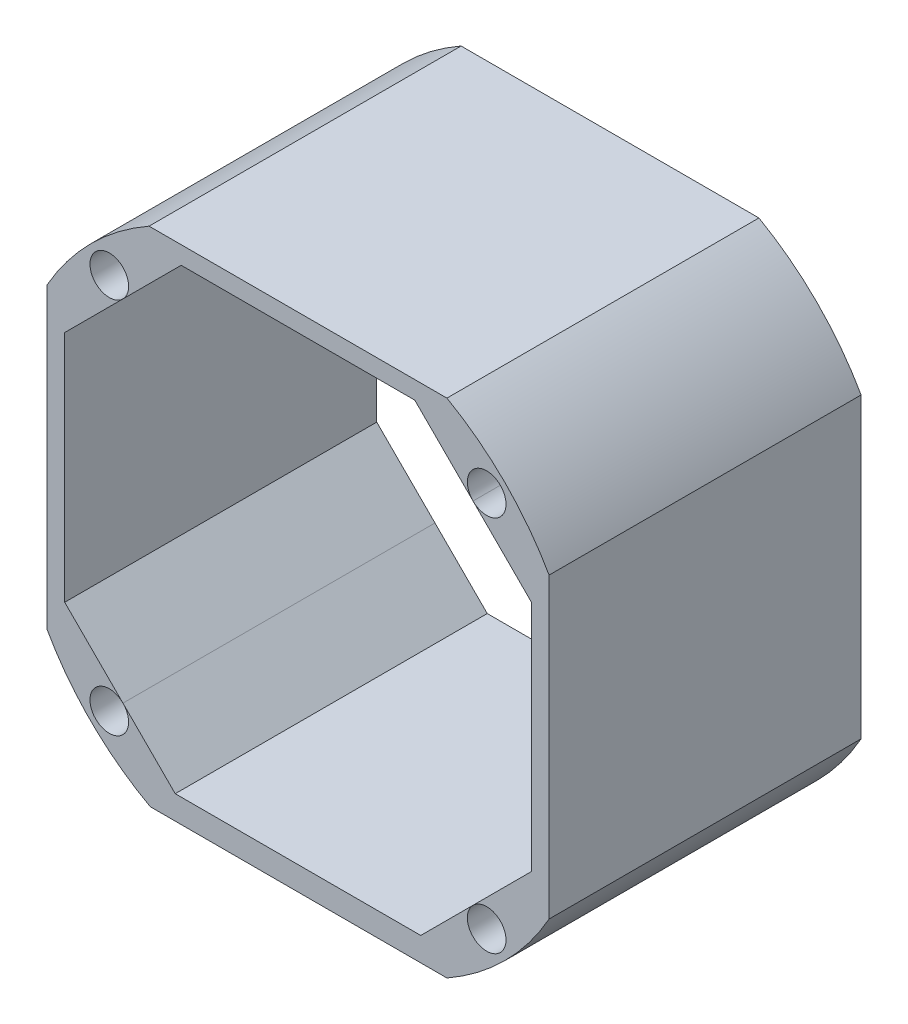
ISO-10303-21;
HEADER;
FILE_DESCRIPTION(('STEP AP214'),'2;1');
FILE_NAME('part.step','',(''),(''),'','','');
FILE_SCHEMA(('AUTOMOTIVE_DESIGN { 1 0 10303 214 1 1 1 1 }'));
ENDSEC;
DATA;
#1=APPLICATION_CONTEXT('core data for automotive mechanical design processes');
#2=APPLICATION_PROTOCOL_DEFINITION('international standard','automotive_design',2000,#1);
#3=PRODUCT_CONTEXT('',#1,'mechanical');
#4=PRODUCT('Part','Part','',(#3));
#5=PRODUCT_RELATED_PRODUCT_CATEGORY('part','',(#4));
#6=PRODUCT_DEFINITION_FORMATION('','',#4);
#7=PRODUCT_DEFINITION_CONTEXT('part definition',#1,'design');
#8=PRODUCT_DEFINITION('design','',#6,#7);
#9=PRODUCT_DEFINITION_SHAPE('','',#8);
#10=(LENGTH_UNIT() NAMED_UNIT(*) SI_UNIT(.MILLI.,.METRE.));
#11=(NAMED_UNIT(*) PLANE_ANGLE_UNIT() SI_UNIT($,.RADIAN.));
#12=(NAMED_UNIT(*) SI_UNIT($,.STERADIAN.) SOLID_ANGLE_UNIT());
#13=UNCERTAINTY_MEASURE_WITH_UNIT(LENGTH_MEASURE(1.E-05),#10,'distance_accuracy_value','');
#14=(GEOMETRIC_REPRESENTATION_CONTEXT(3) GLOBAL_UNCERTAINTY_ASSIGNED_CONTEXT((#13)) GLOBAL_UNIT_ASSIGNED_CONTEXT((#10,
#11,#12)) REPRESENTATION_CONTEXT('',''));
#15=CARTESIAN_POINT('',(0.,0.,0.));
#16=DIRECTION('',(0.,0.,1.));
#17=DIRECTION('',(1.,0.,0.));
#18=AXIS2_PLACEMENT_3D('',#15,#16,#17);
#19=CARTESIAN_POINT('',(21.125,21.125,9.75));
#20=DIRECTION('',(0.,0.,1.));
#21=DIRECTION('',(1.,0.,0.));
#22=AXIS2_PLACEMENT_3D('',#19,#20,#21);
#23=PLANE('',#22);
#24=DIRECTION('',(-1.,0.,0.));
#25=VECTOR('',#24,1.);
#26=CARTESIAN_POINT('',(10.7980970388563,2.,9.75));
#27=LINE('',#26,#25);
#28=CARTESIAN_POINT('',(31.4519029611437,2.,9.75));
#29=VERTEX_POINT('',#28);
#30=CARTESIAN_POINT('',(10.7980970388563,2.,9.75));
#31=VERTEX_POINT('',#30);
#32=EDGE_CURVE('E277',#29,#31,#27,.T.);
#33=ORIENTED_EDGE('',*,*,#32,.F.);
#34=DIRECTION('',(-0.707106781186548,-0.707106781186548,0.));
#35=VECTOR('',#34,1.);
#36=CARTESIAN_POINT('',(31.4519029611437,2.,9.75));
#37=LINE('',#36,#35);
#38=CARTESIAN_POINT('',(35.8509514805719,6.39904851942814,9.75));
#39=VERTEX_POINT('',#38);
#40=EDGE_CURVE('E293',#39,#29,#37,.T.);
#41=ORIENTED_EDGE('',*,*,#40,.F.);
#42=CARTESIAN_POINT('',(37.,5.25,9.75));
#43=DIRECTION('',(0.,0.,-1.));
#44=DIRECTION('',(-1.,0.,0.));
#45=AXIS2_PLACEMENT_3D('',#42,#43,#44);
#46=CIRCLE('',#45,1.625);
#47=CARTESIAN_POINT('',(38.625,5.25,9.75));
#48=VERTEX_POINT('',#47);
#49=EDGE_CURVE('E350',#48,#39,#46,.T.);
#50=ORIENTED_EDGE('',*,*,#49,.F.);
#51=CARTESIAN_POINT('',(37.,5.25,9.75));
#52=DIRECTION('',(0.,0.,-1.));
#53=DIRECTION('',(-1.,0.,0.));
#54=AXIS2_PLACEMENT_3D('',#51,#52,#53);
#55=CIRCLE('',#54,1.625);
#56=CARTESIAN_POINT('',(35.8509514805719,6.39904851942814,9.75));
#57=VERTEX_POINT('',#56);
#58=EDGE_CURVE('E300',#57,#48,#55,.T.);
#59=ORIENTED_EDGE('',*,*,#58,.F.);
#60=DIRECTION('',(-0.707106781186548,-0.707106781186548,0.));
#61=VECTOR('',#60,1.);
#62=CARTESIAN_POINT('',(31.4519029611437,2.,9.75));
#63=LINE('',#62,#61);
#64=CARTESIAN_POINT('',(40.75,11.2980970388563,9.75));
#65=VERTEX_POINT('',#64);
#66=EDGE_CURVE('E404',#65,#57,#63,.T.);
#67=ORIENTED_EDGE('',*,*,#66,.F.);
#68=DIRECTION('',(0.,-1.,0.));
#69=VECTOR('',#68,1.);
#70=CARTESIAN_POINT('',(40.75,30.9519029611437,9.75));
#71=LINE('',#70,#69);
#72=CARTESIAN_POINT('',(40.75,30.9519029611437,9.75));
#73=VERTEX_POINT('',#72);
#74=EDGE_CURVE('E466',#73,#65,#71,.T.);
#75=ORIENTED_EDGE('',*,*,#74,.F.);
#76=DIRECTION('',(0.707106781186548,-0.707106781186548,0.));
#77=VECTOR('',#76,1.);
#78=CARTESIAN_POINT('',(30.9519029611437,40.75,9.75));
#79=LINE('',#78,#77);
#80=CARTESIAN_POINT('',(35.8509514805719,35.8509514805719,9.75));
#81=VERTEX_POINT('',#80);
#82=EDGE_CURVE('E331',#81,#73,#79,.T.);
#83=ORIENTED_EDGE('',*,*,#82,.F.);
#84=CARTESIAN_POINT('',(37.,37.,9.75));
#85=DIRECTION('',(0.,0.,-1.));
#86=DIRECTION('',(-1.,0.,0.));
#87=AXIS2_PLACEMENT_3D('',#84,#85,#86);
#88=CIRCLE('',#87,1.625);
#89=CARTESIAN_POINT('',(38.625,37.,9.75));
#90=VERTEX_POINT('',#89);
#91=EDGE_CURVE('E310',#90,#81,#88,.T.);
#92=ORIENTED_EDGE('',*,*,#91,.F.);
#93=CARTESIAN_POINT('',(37.,37.,9.75));
#94=DIRECTION('',(0.,0.,-1.));
#95=DIRECTION('',(-1.,0.,0.));
#96=AXIS2_PLACEMENT_3D('',#93,#94,#95);
#97=CIRCLE('',#96,1.625);
#98=CARTESIAN_POINT('',(35.8509514805719,35.8509514805719,9.75));
#99=VERTEX_POINT('',#98);
#100=EDGE_CURVE('E501',#99,#90,#97,.T.);
#101=ORIENTED_EDGE('',*,*,#100,.F.);
#102=DIRECTION('',(0.707106781186548,-0.707106781186548,0.));
#103=VECTOR('',#102,1.);
#104=CARTESIAN_POINT('',(30.9519029611437,40.75,9.75));
#105=LINE('',#104,#103);
#106=CARTESIAN_POINT('',(30.9519029611437,40.75,9.75));
#107=VERTEX_POINT('',#106);
#108=EDGE_CURVE('E353',#107,#99,#105,.T.);
#109=ORIENTED_EDGE('',*,*,#108,.F.);
#110=DIRECTION('',(1.,0.,0.));
#111=VECTOR('',#110,1.);
#112=CARTESIAN_POINT('',(11.2980970388563,40.75,9.75));
#113=LINE('',#112,#111);
#114=CARTESIAN_POINT('',(11.2980970388563,40.75,9.75));
#115=VERTEX_POINT('',#114);
#116=EDGE_CURVE('E459',#115,#107,#113,.T.);
#117=ORIENTED_EDGE('',*,*,#116,.F.);
#118=DIRECTION('',(0.707106781186548,0.707106781186547,0.));
#119=VECTOR('',#118,1.);
#120=CARTESIAN_POINT('',(1.5,30.9519029611437,9.75));
#121=LINE('',#120,#119);
#122=CARTESIAN_POINT('',(6.39904851942814,35.8509514805719,9.75));
#123=VERTEX_POINT('',#122);
#124=EDGE_CURVE('E441',#123,#115,#121,.T.);
#125=ORIENTED_EDGE('',*,*,#124,.F.);
#126=CARTESIAN_POINT('',(5.25,37.,9.75));
#127=DIRECTION('',(0.,0.,-1.));
#128=DIRECTION('',(-1.,0.,0.));
#129=AXIS2_PLACEMENT_3D('',#126,#127,#128);
#130=CIRCLE('',#129,1.625);
#131=CARTESIAN_POINT('',(6.875,37.,9.75));
#132=VERTEX_POINT('',#131);
#133=EDGE_CURVE('E316',#132,#123,#130,.T.);
#134=ORIENTED_EDGE('',*,*,#133,.F.);
#135=CARTESIAN_POINT('',(5.25,37.,9.75));
#136=DIRECTION('',(0.,0.,-1.));
#137=DIRECTION('',(-1.,0.,0.));
#138=AXIS2_PLACEMENT_3D('',#135,#136,#137);
#139=CIRCLE('',#138,1.625);
#140=CARTESIAN_POINT('',(6.39904851942814,35.8509514805719,9.75));
#141=VERTEX_POINT('',#140);
#142=EDGE_CURVE('E318',#141,#132,#139,.T.);
#143=ORIENTED_EDGE('',*,*,#142,.F.);
#144=DIRECTION('',(0.707106781186548,0.707106781186547,0.));
#145=VECTOR('',#144,1.);
#146=CARTESIAN_POINT('',(1.5,30.9519029611437,9.75));
#147=LINE('',#146,#145);
#148=CARTESIAN_POINT('',(1.5,30.9519029611437,9.75));
#149=VERTEX_POINT('',#148);
#150=EDGE_CURVE('E434',#149,#141,#147,.T.);
#151=ORIENTED_EDGE('',*,*,#150,.F.);
#152=DIRECTION('',(0.,1.,0.));
#153=VECTOR('',#152,1.);
#154=CARTESIAN_POINT('',(1.5,11.2980970388563,9.75));
#155=LINE('',#154,#153);
#156=CARTESIAN_POINT('',(1.5,11.2980970388563,9.75));
#157=VERTEX_POINT('',#156);
#158=EDGE_CURVE('E336',#157,#149,#155,.T.);
#159=ORIENTED_EDGE('',*,*,#158,.F.);
#160=DIRECTION('',(-0.707106781186548,0.707106781186547,0.));
#161=VECTOR('',#160,1.);
#162=CARTESIAN_POINT('',(10.7980970388563,2.,9.75));
#163=LINE('',#162,#161);
#164=CARTESIAN_POINT('',(6.39904851942814,6.39904851942814,9.75));
#165=VERTEX_POINT('',#164);
#166=EDGE_CURVE('E341',#165,#157,#163,.T.);
#167=ORIENTED_EDGE('',*,*,#166,.F.);
#168=CARTESIAN_POINT('',(5.25,5.25,9.75));
#169=DIRECTION('',(0.,0.,-1.));
#170=DIRECTION('',(-1.,0.,0.));
#171=AXIS2_PLACEMENT_3D('',#168,#169,#170);
#172=CIRCLE('',#171,1.625);
#173=CARTESIAN_POINT('',(6.875,5.25,9.75));
#174=VERTEX_POINT('',#173);
#175=EDGE_CURVE('E367',#174,#165,#172,.T.);
#176=ORIENTED_EDGE('',*,*,#175,.F.);
#177=CARTESIAN_POINT('',(5.25,5.25,9.75));
#178=DIRECTION('',(0.,0.,-1.));
#179=DIRECTION('',(-1.,0.,0.));
#180=AXIS2_PLACEMENT_3D('',#177,#178,#179);
#181=CIRCLE('',#180,1.625);
#182=CARTESIAN_POINT('',(6.39904851942814,6.39904851942814,9.75));
#183=VERTEX_POINT('',#182);
#184=EDGE_CURVE('E451',#183,#174,#181,.T.);
#185=ORIENTED_EDGE('',*,*,#184,.F.);
#186=DIRECTION('',(-0.707106781186548,0.707106781186547,0.));
#187=VECTOR('',#186,1.);
#188=CARTESIAN_POINT('',(10.7980970388563,2.,9.75));
#189=LINE('',#188,#187);
#190=EDGE_CURVE('E375',#31,#183,#189,.T.);
#191=ORIENTED_EDGE('',*,*,#190,.F.);
#192=EDGE_LOOP('',(#33,#41,#50,#59,#67,#75,#83,#92,#101,#109,#117,#125,#134,#143,#151,#159,#167,
#176,#185,#191));
#193=FACE_BOUND('',#192,.T.);
#194=CARTESIAN_POINT('',(19.7734403041991,22.4765596958009,9.75));
#195=DIRECTION('',(0.,0.,1.));
#196=DIRECTION('',(-0.49208908388798,0.870544848654157,0.));
#197=AXIS2_PLACEMENT_3D('',#194,#195,#196);
#198=CIRCLE('',#197,22.7138674529732);
#199=CARTESIAN_POINT('',(8.59619407771256,42.25,9.75));
#200=VERTEX_POINT('',#199);
#201=CARTESIAN_POINT('',(0.,33.6538059222875,9.75));
#202=VERTEX_POINT('',#201);
#203=EDGE_CURVE('E27',#200,#202,#198,.T.);
#204=ORIENTED_EDGE('',*,*,#203,.F.);
#205=DIRECTION('',(1.,0.,0.));
#206=VECTOR('',#205,1.);
#207=CARTESIAN_POINT('',(8.59619407771256,42.25,9.75));
#208=LINE('',#207,#206);
#209=CARTESIAN_POINT('',(33.6538059222875,42.25,9.75));
#210=VERTEX_POINT('',#209);
#211=EDGE_CURVE('E276',#200,#210,#208,.T.);
#212=ORIENTED_EDGE('',*,*,#211,.T.);
#213=CARTESIAN_POINT('',(22.4765596958007,22.4765596958007,9.75));
#214=DIRECTION('',(0.,0.,1.));
#215=DIRECTION('',(0.870544848654156,0.492089083887982,0.));
#216=AXIS2_PLACEMENT_3D('',#213,#214,#215);
#217=CIRCLE('',#216,22.7138674529734);
#218=CARTESIAN_POINT('',(42.25,33.6538059222875,9.75));
#219=VERTEX_POINT('',#218);
#220=EDGE_CURVE('E497',#219,#210,#217,.T.);
#221=ORIENTED_EDGE('',*,*,#220,.F.);
#222=DIRECTION('',(0.,-1.,0.));
#223=VECTOR('',#222,1.);
#224=CARTESIAN_POINT('',(42.25,33.6538059222875,9.75));
#225=LINE('',#224,#223);
#226=CARTESIAN_POINT('',(42.25,8.59619407771256,9.75));
#227=VERTEX_POINT('',#226);
#228=EDGE_CURVE('E384',#219,#227,#225,.T.);
#229=ORIENTED_EDGE('',*,*,#228,.T.);
#230=CARTESIAN_POINT('',(22.4765596958008,19.7734403041992,9.75));
#231=DIRECTION('',(0.,0.,1.));
#232=DIRECTION('',(0.49208908388798,-0.870544848654157,0.));
#233=AXIS2_PLACEMENT_3D('',#230,#231,#232);
#234=CIRCLE('',#233,22.7138674529733);
#235=CARTESIAN_POINT('',(33.6538059222874,0.,9.75));
#236=VERTEX_POINT('',#235);
#237=EDGE_CURVE('E374',#236,#227,#234,.T.);
#238=ORIENTED_EDGE('',*,*,#237,.F.);
#239=DIRECTION('',(1.,0.,0.));
#240=VECTOR('',#239,1.);
#241=CARTESIAN_POINT('',(8.69714555828442,0.,9.75));
#242=LINE('',#241,#240);
#243=CARTESIAN_POINT('',(8.69714555828442,0.,9.75));
#244=VERTEX_POINT('',#243);
#245=EDGE_CURVE('E390',#244,#236,#242,.T.);
#246=ORIENTED_EDGE('',*,*,#245,.F.);
#247=CARTESIAN_POINT('',(19.2541448916106,19.3787163361511,9.75));
#248=DIRECTION('',(0.,0.,1.));
#249=DIRECTION('',(-0.872502130658051,-0.488610306887976,0.));
#250=AXIS2_PLACEMENT_3D('',#247,#248,#249);
#251=CIRCLE('',#250,22.0677339516512);
#252=CARTESIAN_POINT('',(0.,8.59619407771256,9.75));
#253=VERTEX_POINT('',#252);
#254=EDGE_CURVE('E324',#253,#244,#251,.T.);
#255=ORIENTED_EDGE('',*,*,#254,.F.);
#256=DIRECTION('',(0.,1.,0.));
#257=VECTOR('',#256,1.);
#258=CARTESIAN_POINT('',(0.,8.59619407771256,9.75));
#259=LINE('',#258,#257);
#260=EDGE_CURVE('E349',#253,#202,#259,.T.);
#261=ORIENTED_EDGE('',*,*,#260,.T.);
#262=EDGE_LOOP('',(#204,#212,#221,#229,#238,#246,#255,#261));
#263=FACE_BOUND('',#262,.T.);
#264=ADVANCED_FACE('F17',(#193,#263),#23,.F.);
#265=CARTESIAN_POINT('',(21.125,21.125,36.));
#266=DIRECTION('',(0.,0.,1.));
#267=DIRECTION('',(1.,0.,0.));
#268=AXIS2_PLACEMENT_3D('',#265,#266,#267);
#269=PLANE('',#268);
#270=DIRECTION('',(-1.,0.,0.));
#271=VECTOR('',#270,1.);
#272=CARTESIAN_POINT('',(10.7980970388563,2.,36.));
#273=LINE('',#272,#271);
#274=CARTESIAN_POINT('',(31.4519029611437,2.,36.));
#275=VERTEX_POINT('',#274);
#276=CARTESIAN_POINT('',(10.7980970388563,2.,36.));
#277=VERTEX_POINT('',#276);
#278=EDGE_CURVE('E264',#275,#277,#273,.T.);
#279=ORIENTED_EDGE('',*,*,#278,.T.);
#280=DIRECTION('',(-0.707106781186548,0.707106781186547,0.));
#281=VECTOR('',#280,1.);
#282=CARTESIAN_POINT('',(10.7980970388563,2.,36.));
#283=LINE('',#282,#281);
#284=CARTESIAN_POINT('',(6.39904851942814,6.39904851942814,36.));
#285=VERTEX_POINT('',#284);
#286=EDGE_CURVE('E379',#277,#285,#283,.T.);
#287=ORIENTED_EDGE('',*,*,#286,.T.);
#288=CARTESIAN_POINT('',(5.25,5.25,36.));
#289=DIRECTION('',(0.,0.,-1.));
#290=DIRECTION('',(-1.,0.,0.));
#291=AXIS2_PLACEMENT_3D('',#288,#289,#290);
#292=CIRCLE('',#291,1.625);
#293=CARTESIAN_POINT('',(6.875,5.25,36.));
#294=VERTEX_POINT('',#293);
#295=EDGE_CURVE('E40',#285,#294,#292,.T.);
#296=ORIENTED_EDGE('',*,*,#295,.T.);
#297=CARTESIAN_POINT('',(5.25,5.25,36.));
#298=DIRECTION('',(0.,0.,-1.));
#299=DIRECTION('',(-1.,0.,0.));
#300=AXIS2_PLACEMENT_3D('',#297,#298,#299);
#301=CIRCLE('',#300,1.625);
#302=CARTESIAN_POINT('',(6.39904851942814,6.39904851942814,36.));
#303=VERTEX_POINT('',#302);
#304=EDGE_CURVE('E370',#294,#303,#301,.T.);
#305=ORIENTED_EDGE('',*,*,#304,.T.);
#306=DIRECTION('',(-0.707106781186548,0.707106781186547,0.));
#307=VECTOR('',#306,1.);
#308=CARTESIAN_POINT('',(10.7980970388563,2.,36.));
#309=LINE('',#308,#307);
#310=CARTESIAN_POINT('',(1.5,11.2980970388563,36.));
#311=VERTEX_POINT('',#310);
#312=EDGE_CURVE('E344',#303,#311,#309,.T.);
#313=ORIENTED_EDGE('',*,*,#312,.T.);
#314=DIRECTION('',(0.,1.,0.));
#315=VECTOR('',#314,1.);
#316=CARTESIAN_POINT('',(1.5,11.2980970388563,36.));
#317=LINE('',#316,#315);
#318=CARTESIAN_POINT('',(1.5,30.9519029611437,36.));
#319=VERTEX_POINT('',#318);
#320=EDGE_CURVE('E340',#311,#319,#317,.T.);
#321=ORIENTED_EDGE('',*,*,#320,.T.);
#322=DIRECTION('',(0.707106781186548,0.707106781186547,0.));
#323=VECTOR('',#322,1.);
#324=CARTESIAN_POINT('',(1.5,30.9519029611437,36.));
#325=LINE('',#324,#323);
#326=CARTESIAN_POINT('',(6.39904851942815,35.8509514805719,36.));
#327=VERTEX_POINT('',#326);
#328=EDGE_CURVE('E337',#319,#327,#325,.T.);
#329=ORIENTED_EDGE('',*,*,#328,.T.);
#330=CARTESIAN_POINT('',(5.25,37.,36.));
#331=DIRECTION('',(0.,0.,-1.));
#332=DIRECTION('',(-1.,0.,0.));
#333=AXIS2_PLACEMENT_3D('',#330,#331,#332);
#334=CIRCLE('',#333,1.625);
#335=CARTESIAN_POINT('',(6.875,37.,36.));
#336=VERTEX_POINT('',#335);
#337=EDGE_CURVE('E422',#327,#336,#334,.T.);
#338=ORIENTED_EDGE('',*,*,#337,.T.);
#339=CARTESIAN_POINT('',(5.25,37.,36.));
#340=DIRECTION('',(0.,0.,-1.));
#341=DIRECTION('',(-1.,0.,0.));
#342=AXIS2_PLACEMENT_3D('',#339,#340,#341);
#343=CIRCLE('',#342,1.625);
#344=CARTESIAN_POINT('',(6.39904851942815,35.8509514805719,36.));
#345=VERTEX_POINT('',#344);
#346=EDGE_CURVE('E431',#336,#345,#343,.T.);
#347=ORIENTED_EDGE('',*,*,#346,.T.);
#348=DIRECTION('',(0.707106781186548,0.707106781186547,0.));
#349=VECTOR('',#348,1.);
#350=CARTESIAN_POINT('',(1.5,30.9519029611437,36.));
#351=LINE('',#350,#349);
#352=CARTESIAN_POINT('',(11.2980970388563,40.75,36.));
#353=VERTEX_POINT('',#352);
#354=EDGE_CURVE('E317',#345,#353,#351,.T.);
#355=ORIENTED_EDGE('',*,*,#354,.T.);
#356=DIRECTION('',(1.,0.,0.));
#357=VECTOR('',#356,1.);
#358=CARTESIAN_POINT('',(11.2980970388563,40.75,36.));
#359=LINE('',#358,#357);
#360=CARTESIAN_POINT('',(30.9519029611437,40.75,36.));
#361=VERTEX_POINT('',#360);
#362=EDGE_CURVE('E21',#353,#361,#359,.T.);
#363=ORIENTED_EDGE('',*,*,#362,.T.);
#364=DIRECTION('',(0.707106781186548,-0.707106781186548,0.));
#365=VECTOR('',#364,1.);
#366=CARTESIAN_POINT('',(30.9519029611437,40.75,36.));
#367=LINE('',#366,#365);
#368=CARTESIAN_POINT('',(35.8509514805719,35.8509514805719,36.));
#369=VERTEX_POINT('',#368);
#370=EDGE_CURVE('E357',#361,#369,#367,.T.);
#371=ORIENTED_EDGE('',*,*,#370,.T.);
#372=CARTESIAN_POINT('',(37.,37.,36.));
#373=DIRECTION('',(0.,0.,-1.));
#374=DIRECTION('',(-1.,0.,0.));
#375=AXIS2_PLACEMENT_3D('',#372,#373,#374);
#376=CIRCLE('',#375,1.625);
#377=CARTESIAN_POINT('',(38.625,37.,36.));
#378=VERTEX_POINT('',#377);
#379=EDGE_CURVE('E463',#369,#378,#376,.T.);
#380=ORIENTED_EDGE('',*,*,#379,.T.);
#381=CARTESIAN_POINT('',(37.,37.,36.));
#382=DIRECTION('',(0.,0.,-1.));
#383=DIRECTION('',(-1.,0.,0.));
#384=AXIS2_PLACEMENT_3D('',#381,#382,#383);
#385=CIRCLE('',#384,1.625);
#386=CARTESIAN_POINT('',(35.8509514805719,35.8509514805719,36.));
#387=VERTEX_POINT('',#386);
#388=EDGE_CURVE('E358',#378,#387,#385,.T.);
#389=ORIENTED_EDGE('',*,*,#388,.T.);
#390=DIRECTION('',(0.707106781186548,-0.707106781186548,0.));
#391=VECTOR('',#390,1.);
#392=CARTESIAN_POINT('',(30.9519029611437,40.75,36.));
#393=LINE('',#392,#391);
#394=CARTESIAN_POINT('',(40.75,30.9519029611437,36.));
#395=VERTEX_POINT('',#394);
#396=EDGE_CURVE('E311',#387,#395,#393,.T.);
#397=ORIENTED_EDGE('',*,*,#396,.T.);
#398=DIRECTION('',(0.,-1.,0.));
#399=VECTOR('',#398,1.);
#400=CARTESIAN_POINT('',(40.75,30.9519029611437,36.));
#401=LINE('',#400,#399);
#402=CARTESIAN_POINT('',(40.75,11.2980970388563,36.));
#403=VERTEX_POINT('',#402);
#404=EDGE_CURVE('E414',#395,#403,#401,.T.);
#405=ORIENTED_EDGE('',*,*,#404,.T.);
#406=DIRECTION('',(-0.707106781186548,-0.707106781186548,0.));
#407=VECTOR('',#406,1.);
#408=CARTESIAN_POINT('',(31.4519029611437,2.,36.));
#409=LINE('',#408,#407);
#410=CARTESIAN_POINT('',(35.8509514805719,6.39904851942814,36.));
#411=VERTEX_POINT('',#410);
#412=EDGE_CURVE('E399',#403,#411,#409,.T.);
#413=ORIENTED_EDGE('',*,*,#412,.T.);
#414=CARTESIAN_POINT('',(37.,5.25,36.));
#415=DIRECTION('',(0.,0.,-1.));
#416=DIRECTION('',(-1.,0.,0.));
#417=AXIS2_PLACEMENT_3D('',#414,#415,#416);
#418=CIRCLE('',#417,1.625);
#419=CARTESIAN_POINT('',(38.625,5.25,36.));
#420=VERTEX_POINT('',#419);
#421=EDGE_CURVE('E394',#411,#420,#418,.T.);
#422=ORIENTED_EDGE('',*,*,#421,.T.);
#423=CARTESIAN_POINT('',(37.,5.25,36.));
#424=DIRECTION('',(0.,0.,-1.));
#425=DIRECTION('',(-1.,0.,0.));
#426=AXIS2_PLACEMENT_3D('',#423,#424,#425);
#427=CIRCLE('',#426,1.625);
#428=CARTESIAN_POINT('',(35.8509514805719,6.39904851942814,36.));
#429=VERTEX_POINT('',#428);
#430=EDGE_CURVE('E284',#420,#429,#427,.T.);
#431=ORIENTED_EDGE('',*,*,#430,.T.);
#432=DIRECTION('',(-0.707106781186548,-0.707106781186548,0.));
#433=VECTOR('',#432,1.);
#434=CARTESIAN_POINT('',(31.4519029611437,2.,36.));
#435=LINE('',#434,#433);
#436=EDGE_CURVE('E280',#429,#275,#435,.T.);
#437=ORIENTED_EDGE('',*,*,#436,.T.);
#438=EDGE_LOOP('',(#279,#287,#296,#305,#313,#321,#329,#338,#347,#355,#363,#371,#380,#389,#397,
#405,#413,#422,#431,#437));
#439=FACE_BOUND('',#438,.T.);
#440=CARTESIAN_POINT('',(19.7734403041991,22.4765596958009,36.));
#441=DIRECTION('',(0.,0.,1.));
#442=DIRECTION('',(-0.49208908388798,0.870544848654157,0.));
#443=AXIS2_PLACEMENT_3D('',#440,#441,#442);
#444=CIRCLE('',#443,22.7138674529732);
#445=CARTESIAN_POINT('',(8.59619407771256,42.25,36.));
#446=VERTEX_POINT('',#445);
#447=CARTESIAN_POINT('',(0.,33.6538059222875,36.));
#448=VERTEX_POINT('',#447);
#449=EDGE_CURVE('E11',#446,#448,#444,.T.);
#450=ORIENTED_EDGE('',*,*,#449,.T.);
#451=DIRECTION('',(0.,-1.,0.));
#452=VECTOR('',#451,1.);
#453=CARTESIAN_POINT('',(0.,8.59619407771256,36.));
#454=LINE('',#453,#452);
#455=CARTESIAN_POINT('',(0.,8.59619407771256,36.));
#456=VERTEX_POINT('',#455);
#457=EDGE_CURVE('E346',#448,#456,#454,.T.);
#458=ORIENTED_EDGE('',*,*,#457,.T.);
#459=CARTESIAN_POINT('',(19.2541448916106,19.3787163361511,36.));
#460=DIRECTION('',(0.,0.,1.));
#461=DIRECTION('',(-0.872502130658051,-0.488610306887976,0.));
#462=AXIS2_PLACEMENT_3D('',#459,#460,#461);
#463=CIRCLE('',#462,22.0677339516512);
#464=CARTESIAN_POINT('',(8.69714555828442,0.,36.));
#465=VERTEX_POINT('',#464);
#466=EDGE_CURVE('E327',#456,#465,#463,.T.);
#467=ORIENTED_EDGE('',*,*,#466,.T.);
#468=DIRECTION('',(1.,0.,0.));
#469=VECTOR('',#468,1.);
#470=CARTESIAN_POINT('',(8.69714555828442,0.,36.));
#471=LINE('',#470,#469);
#472=CARTESIAN_POINT('',(33.6538059222874,0.,36.));
#473=VERTEX_POINT('',#472);
#474=EDGE_CURVE('E393',#465,#473,#471,.T.);
#475=ORIENTED_EDGE('',*,*,#474,.T.);
#476=CARTESIAN_POINT('',(22.4765596958008,19.7734403041992,36.));
#477=DIRECTION('',(0.,0.,1.));
#478=DIRECTION('',(0.49208908388798,-0.870544848654157,0.));
#479=AXIS2_PLACEMENT_3D('',#476,#477,#478);
#480=CIRCLE('',#479,22.7138674529733);
#481=CARTESIAN_POINT('',(42.25,8.59619407771256,36.));
#482=VERTEX_POINT('',#481);
#483=EDGE_CURVE('E371',#473,#482,#480,.T.);
#484=ORIENTED_EDGE('',*,*,#483,.T.);
#485=DIRECTION('',(0.,1.,0.));
#486=VECTOR('',#485,1.);
#487=CARTESIAN_POINT('',(42.25,33.6538059222875,36.));
#488=LINE('',#487,#486);
#489=CARTESIAN_POINT('',(42.25,33.6538059222875,36.));
#490=VERTEX_POINT('',#489);
#491=EDGE_CURVE('E380',#482,#490,#488,.T.);
#492=ORIENTED_EDGE('',*,*,#491,.T.);
#493=CARTESIAN_POINT('',(22.4765596958007,22.4765596958007,36.));
#494=DIRECTION('',(0.,0.,1.));
#495=DIRECTION('',(0.870544848654156,0.492089083887982,0.));
#496=AXIS2_PLACEMENT_3D('',#493,#494,#495);
#497=CIRCLE('',#496,22.7138674529734);
#498=CARTESIAN_POINT('',(33.6538059222875,42.25,36.));
#499=VERTEX_POINT('',#498);
#500=EDGE_CURVE('E500',#490,#499,#497,.T.);
#501=ORIENTED_EDGE('',*,*,#500,.T.);
#502=DIRECTION('',(-1.,0.,0.));
#503=VECTOR('',#502,1.);
#504=CARTESIAN_POINT('',(8.59619407771256,42.25,36.));
#505=LINE('',#504,#503);
#506=EDGE_CURVE('E430',#499,#446,#505,.T.);
#507=ORIENTED_EDGE('',*,*,#506,.T.);
#508=EDGE_LOOP('',(#450,#458,#467,#475,#484,#492,#501,#507));
#509=FACE_BOUND('',#508,.T.);
#510=ADVANCED_FACE('F281',(#439,#509),#269,.T.);
#511=CARTESIAN_POINT('',(19.7734403041991,22.4765596958009,9.75));
#512=DIRECTION('',(0.,0.,1.));
#513=DIRECTION('',(-0.49208908388798,0.870544848654157,0.));
#514=AXIS2_PLACEMENT_3D('',#511,#512,#513);
#515=CYLINDRICAL_SURFACE('',#514,22.7138674529732);
#516=ORIENTED_EDGE('',*,*,#203,.T.);
#517=DIRECTION('',(0.,0.,1.));
#518=VECTOR('',#517,1.);
#519=CARTESIAN_POINT('',(0.,33.6538059222875,9.75));
#520=LINE('',#519,#518);
#521=EDGE_CURVE('E304',#202,#448,#520,.T.);
#522=ORIENTED_EDGE('',*,*,#521,.T.);
#523=ORIENTED_EDGE('',*,*,#449,.F.);
#524=DIRECTION('',(0.,0.,1.));
#525=VECTOR('',#524,1.);
#526=CARTESIAN_POINT('',(8.59619407771256,42.25,9.75));
#527=LINE('',#526,#525);
#528=EDGE_CURVE('E426',#200,#446,#527,.T.);
#529=ORIENTED_EDGE('',*,*,#528,.F.);
#530=EDGE_LOOP('',(#516,#522,#523,#529));
#531=FACE_BOUND('',#530,.T.);
#532=ADVANCED_FACE('F953',(#531),#515,.T.);
#533=CARTESIAN_POINT('',(0.,33.6538059222875,9.75));
#534=DIRECTION('',(-1.,0.,0.));
#535=DIRECTION('',(0.,0.,1.));
#536=AXIS2_PLACEMENT_3D('',#533,#534,#535);
#537=PLANE('',#536);
#538=ORIENTED_EDGE('',*,*,#260,.F.);
#539=DIRECTION('',(0.,0.,1.));
#540=VECTOR('',#539,1.);
#541=CARTESIAN_POINT('',(0.,8.59619407771256,9.75));
#542=LINE('',#541,#540);
#543=EDGE_CURVE('E488',#253,#456,#542,.T.);
#544=ORIENTED_EDGE('',*,*,#543,.T.);
#545=ORIENTED_EDGE('',*,*,#457,.F.);
#546=ORIENTED_EDGE('',*,*,#521,.F.);
#547=EDGE_LOOP('',(#538,#544,#545,#546));
#548=FACE_BOUND('',#547,.T.);
#549=ADVANCED_FACE('F19',(#548),#537,.T.);
#550=CARTESIAN_POINT('',(19.2541448916106,19.3787163361511,9.75));
#551=DIRECTION('',(0.,0.,1.));
#552=DIRECTION('',(-0.872502130658051,-0.488610306887976,0.));
#553=AXIS2_PLACEMENT_3D('',#550,#551,#552);
#554=CYLINDRICAL_SURFACE('',#553,22.0677339516512);
#555=ORIENTED_EDGE('',*,*,#254,.T.);
#556=DIRECTION('',(0.,0.,1.));
#557=VECTOR('',#556,1.);
#558=CARTESIAN_POINT('',(8.69714555828442,0.,9.75));
#559=LINE('',#558,#557);
#560=EDGE_CURVE('E328',#244,#465,#559,.T.);
#561=ORIENTED_EDGE('',*,*,#560,.T.);
#562=ORIENTED_EDGE('',*,*,#466,.F.);
#563=ORIENTED_EDGE('',*,*,#543,.F.);
#564=EDGE_LOOP('',(#555,#561,#562,#563));
#565=FACE_BOUND('',#564,.T.);
#566=ADVANCED_FACE('F933',(#565),#554,.T.);
#567=CARTESIAN_POINT('',(8.69714555828442,0.,9.75));
#568=DIRECTION('',(0.,-1.,0.));
#569=DIRECTION('',(-1.,0.,0.));
#570=AXIS2_PLACEMENT_3D('',#567,#568,#569);
#571=PLANE('',#570);
#572=ORIENTED_EDGE('',*,*,#245,.T.);
#573=DIRECTION('',(0.,0.,1.));
#574=VECTOR('',#573,1.);
#575=CARTESIAN_POINT('',(33.6538059222874,0.,9.75));
#576=LINE('',#575,#574);
#577=EDGE_CURVE('E373',#236,#473,#576,.T.);
#578=ORIENTED_EDGE('',*,*,#577,.T.);
#579=ORIENTED_EDGE('',*,*,#474,.F.);
#580=ORIENTED_EDGE('',*,*,#560,.F.);
#581=EDGE_LOOP('',(#572,#578,#579,#580));
#582=FACE_BOUND('',#581,.T.);
#583=ADVANCED_FACE('F923',(#582),#571,.T.);
#584=CARTESIAN_POINT('',(22.4765596958008,19.7734403041992,9.75));
#585=DIRECTION('',(0.,0.,1.));
#586=DIRECTION('',(0.49208908388798,-0.870544848654157,0.));
#587=AXIS2_PLACEMENT_3D('',#584,#585,#586);
#588=CYLINDRICAL_SURFACE('',#587,22.7138674529733);
#589=ORIENTED_EDGE('',*,*,#237,.T.);
#590=DIRECTION('',(0.,0.,1.));
#591=VECTOR('',#590,1.);
#592=CARTESIAN_POINT('',(42.25,8.59619407771256,9.75));
#593=LINE('',#592,#591);
#594=EDGE_CURVE('E383',#227,#482,#593,.T.);
#595=ORIENTED_EDGE('',*,*,#594,.T.);
#596=ORIENTED_EDGE('',*,*,#483,.F.);
#597=ORIENTED_EDGE('',*,*,#577,.F.);
#598=EDGE_LOOP('',(#589,#595,#596,#597));
#599=FACE_BOUND('',#598,.T.);
#600=ADVANCED_FACE('F912',(#599),#588,.T.);
#601=CARTESIAN_POINT('',(42.25,8.59619407771256,9.75));
#602=DIRECTION('',(1.,0.,0.));
#603=DIRECTION('',(0.,1.,0.));
#604=AXIS2_PLACEMENT_3D('',#601,#602,#603);
#605=PLANE('',#604);
#606=ORIENTED_EDGE('',*,*,#228,.F.);
#607=DIRECTION('',(0.,0.,1.));
#608=VECTOR('',#607,1.);
#609=CARTESIAN_POINT('',(42.25,33.6538059222875,9.75));
#610=LINE('',#609,#608);
#611=EDGE_CURVE('E418',#219,#490,#610,.T.);
#612=ORIENTED_EDGE('',*,*,#611,.T.);
#613=ORIENTED_EDGE('',*,*,#491,.F.);
#614=ORIENTED_EDGE('',*,*,#594,.F.);
#615=EDGE_LOOP('',(#606,#612,#613,#614));
#616=FACE_BOUND('',#615,.T.);
#617=ADVANCED_FACE('F901',(#616),#605,.T.);
#618=CARTESIAN_POINT('',(22.4765596958007,22.4765596958007,9.75));
#619=DIRECTION('',(0.,0.,1.));
#620=DIRECTION('',(0.870544848654156,0.492089083887982,0.));
#621=AXIS2_PLACEMENT_3D('',#618,#619,#620);
#622=CYLINDRICAL_SURFACE('',#621,22.7138674529734);
#623=ORIENTED_EDGE('',*,*,#220,.T.);
#624=DIRECTION('',(0.,0.,1.));
#625=VECTOR('',#624,1.);
#626=CARTESIAN_POINT('',(33.6538059222875,42.25,9.75));
#627=LINE('',#626,#625);
#628=EDGE_CURVE('E471',#210,#499,#627,.T.);
#629=ORIENTED_EDGE('',*,*,#628,.T.);
#630=ORIENTED_EDGE('',*,*,#500,.F.);
#631=ORIENTED_EDGE('',*,*,#611,.F.);
#632=EDGE_LOOP('',(#623,#629,#630,#631));
#633=FACE_BOUND('',#632,.T.);
#634=ADVANCED_FACE('F891',(#633),#622,.T.);
#635=CARTESIAN_POINT('',(33.6538059222875,42.25,9.75));
#636=DIRECTION('',(0.,1.,0.));
#637=DIRECTION('',(1.,0.,0.));
#638=AXIS2_PLACEMENT_3D('',#635,#636,#637);
#639=PLANE('',#638);
#640=ORIENTED_EDGE('',*,*,#211,.F.);
#641=ORIENTED_EDGE('',*,*,#528,.T.);
#642=ORIENTED_EDGE('',*,*,#506,.F.);
#643=ORIENTED_EDGE('',*,*,#628,.F.);
#644=EDGE_LOOP('',(#640,#641,#642,#643));
#645=FACE_BOUND('',#644,.T.);
#646=ADVANCED_FACE('F881',(#645),#639,.T.);
#647=CARTESIAN_POINT('',(31.4519029611437,2.,9.75));
#648=DIRECTION('',(0.,1.,0.));
#649=DIRECTION('',(1.,0.,0.));
#650=AXIS2_PLACEMENT_3D('',#647,#648,#649);
#651=PLANE('',#650);
#652=ORIENTED_EDGE('',*,*,#32,.T.);
#653=DIRECTION('',(0.,0.,1.));
#654=VECTOR('',#653,1.);
#655=CARTESIAN_POINT('',(10.7980970388563,2.,9.75));
#656=LINE('',#655,#654);
#657=EDGE_CURVE('E271',#31,#277,#656,.T.);
#658=ORIENTED_EDGE('',*,*,#657,.T.);
#659=ORIENTED_EDGE('',*,*,#278,.F.);
#660=DIRECTION('',(0.,0.,1.));
#661=VECTOR('',#660,1.);
#662=CARTESIAN_POINT('',(31.4519029611437,2.,9.75));
#663=LINE('',#662,#661);
#664=EDGE_CURVE('E268',#29,#275,#663,.T.);
#665=ORIENTED_EDGE('',*,*,#664,.F.);
#666=EDGE_LOOP('',(#652,#658,#659,#665));
#667=FACE_BOUND('',#666,.T.);
#668=ADVANCED_FACE('F266',(#667),#651,.T.);
#669=CARTESIAN_POINT('',(10.7980970388563,2.,9.75));
#670=DIRECTION('',(0.707106781186547,0.707106781186548,0.));
#671=DIRECTION('',(0.,0.,-1.));
#672=AXIS2_PLACEMENT_3D('',#669,#670,#671);
#673=PLANE('',#672);
#674=ORIENTED_EDGE('',*,*,#190,.T.);
#675=DIRECTION('',(0.,0.,1.));
#676=VECTOR('',#675,1.);
#677=CARTESIAN_POINT('',(6.39904851942814,6.39904851942814,9.75));
#678=LINE('',#677,#676);
#679=EDGE_CURVE('E48',#183,#285,#678,.T.);
#680=ORIENTED_EDGE('',*,*,#679,.T.);
#681=ORIENTED_EDGE('',*,*,#286,.F.);
#682=ORIENTED_EDGE('',*,*,#657,.F.);
#683=EDGE_LOOP('',(#674,#680,#681,#682));
#684=FACE_BOUND('',#683,.T.);
#685=ADVANCED_FACE('F862',(#684),#673,.T.);
#686=CARTESIAN_POINT('',(5.25,5.25,9.75));
#687=DIRECTION('',(0.,0.,1.));
#688=DIRECTION('',(-1.,0.,0.));
#689=AXIS2_PLACEMENT_3D('',#686,#687,#688);
#690=CYLINDRICAL_SURFACE('',#689,1.625);
#691=DIRECTION('',(0.,0.,-1.));
#692=VECTOR('',#691,1.);
#693=CARTESIAN_POINT('',(6.875,5.25,9.75));
#694=LINE('',#693,#692);
#695=EDGE_CURVE('E493',#294,#174,#694,.T.);
#696=ORIENTED_EDGE('',*,*,#695,.T.);
#697=ORIENTED_EDGE('',*,*,#175,.T.);
#698=DIRECTION('',(0.,0.,1.));
#699=VECTOR('',#698,1.);
#700=CARTESIAN_POINT('',(6.39904851942814,6.39904851942814,9.75));
#701=LINE('',#700,#699);
#702=EDGE_CURVE('E363',#165,#303,#701,.T.);
#703=ORIENTED_EDGE('',*,*,#702,.T.);
#704=ORIENTED_EDGE('',*,*,#304,.F.);
#705=EDGE_LOOP('',(#696,#697,#703,#704));
#706=FACE_BOUND('',#705,.T.);
#707=ADVANCED_FACE('F852',(#706),#690,.F.);
#708=CARTESIAN_POINT('',(6.39904851942815,6.39904851942815,9.75));
#709=DIRECTION('',(0.707106781186547,0.707106781186548,0.));
#710=DIRECTION('',(0.,0.,-1.));
#711=AXIS2_PLACEMENT_3D('',#708,#709,#710);
#712=PLANE('',#711);
#713=ORIENTED_EDGE('',*,*,#166,.T.);
#714=DIRECTION('',(0.,0.,1.));
#715=VECTOR('',#714,1.);
#716=CARTESIAN_POINT('',(1.5,11.2980970388563,9.75));
#717=LINE('',#716,#715);
#718=EDGE_CURVE('E345',#157,#311,#717,.T.);
#719=ORIENTED_EDGE('',*,*,#718,.T.);
#720=ORIENTED_EDGE('',*,*,#312,.F.);
#721=ORIENTED_EDGE('',*,*,#702,.F.);
#722=EDGE_LOOP('',(#713,#719,#720,#721));
#723=FACE_BOUND('',#722,.T.);
#724=ADVANCED_FACE('F841',(#723),#712,.T.);
#725=CARTESIAN_POINT('',(1.5,11.2980970388563,9.75));
#726=DIRECTION('',(1.,0.,0.));
#727=DIRECTION('',(0.,1.,0.));
#728=AXIS2_PLACEMENT_3D('',#725,#726,#727);
#729=PLANE('',#728);
#730=ORIENTED_EDGE('',*,*,#158,.T.);
#731=DIRECTION('',(0.,0.,1.));
#732=VECTOR('',#731,1.);
#733=CARTESIAN_POINT('',(1.5,30.9519029611437,9.75));
#734=LINE('',#733,#732);
#735=EDGE_CURVE('E332',#149,#319,#734,.T.);
#736=ORIENTED_EDGE('',*,*,#735,.T.);
#737=ORIENTED_EDGE('',*,*,#320,.F.);
#738=ORIENTED_EDGE('',*,*,#718,.F.);
#739=EDGE_LOOP('',(#730,#736,#737,#738));
#740=FACE_BOUND('',#739,.T.);
#741=ADVANCED_FACE('F831',(#740),#729,.T.);
#742=CARTESIAN_POINT('',(1.5,30.9519029611437,9.75));
#743=DIRECTION('',(0.707106781186547,-0.707106781186548,0.));
#744=DIRECTION('',(0.,0.,-1.));
#745=AXIS2_PLACEMENT_3D('',#742,#743,#744);
#746=PLANE('',#745);
#747=ORIENTED_EDGE('',*,*,#150,.T.);
#748=DIRECTION('',(0.,0.,1.));
#749=VECTOR('',#748,1.);
#750=CARTESIAN_POINT('',(6.39904851942814,35.8509514805719,9.75));
#751=LINE('',#750,#749);
#752=EDGE_CURVE('E323',#141,#327,#751,.T.);
#753=ORIENTED_EDGE('',*,*,#752,.T.);
#754=ORIENTED_EDGE('',*,*,#328,.F.);
#755=ORIENTED_EDGE('',*,*,#735,.F.);
#756=EDGE_LOOP('',(#747,#753,#754,#755));
#757=FACE_BOUND('',#756,.T.);
#758=ADVANCED_FACE('F820',(#757),#746,.T.);
#759=CARTESIAN_POINT('',(5.25,37.,9.75));
#760=DIRECTION('',(0.,0.,1.));
#761=DIRECTION('',(-1.,0.,0.));
#762=AXIS2_PLACEMENT_3D('',#759,#760,#761);
#763=CYLINDRICAL_SURFACE('',#762,1.625);
#764=DIRECTION('',(0.,0.,-1.));
#765=VECTOR('',#764,1.);
#766=CARTESIAN_POINT('',(6.875,37.,9.75));
#767=LINE('',#766,#765);
#768=EDGE_CURVE('E450',#336,#132,#767,.T.);
#769=ORIENTED_EDGE('',*,*,#768,.T.);
#770=ORIENTED_EDGE('',*,*,#133,.T.);
#771=DIRECTION('',(0.,0.,1.));
#772=VECTOR('',#771,1.);
#773=CARTESIAN_POINT('',(6.39904851942814,35.8509514805719,9.75));
#774=LINE('',#773,#772);
#775=EDGE_CURVE('E312',#123,#345,#774,.T.);
#776=ORIENTED_EDGE('',*,*,#775,.T.);
#777=ORIENTED_EDGE('',*,*,#346,.F.);
#778=EDGE_LOOP('',(#769,#770,#776,#777));
#779=FACE_BOUND('',#778,.T.);
#780=ADVANCED_FACE('F809',(#779),#763,.F.);
#781=CARTESIAN_POINT('',(6.39904851942814,35.8509514805719,9.75));
#782=DIRECTION('',(0.707106781186547,-0.707106781186548,0.));
#783=DIRECTION('',(0.,0.,-1.));
#784=AXIS2_PLACEMENT_3D('',#781,#782,#783);
#785=PLANE('',#784);
#786=ORIENTED_EDGE('',*,*,#124,.T.);
#787=DIRECTION('',(0.,0.,1.));
#788=VECTOR('',#787,1.);
#789=CARTESIAN_POINT('',(11.2980970388563,40.75,9.75));
#790=LINE('',#789,#788);
#791=EDGE_CURVE('E437',#115,#353,#790,.T.);
#792=ORIENTED_EDGE('',*,*,#791,.T.);
#793=ORIENTED_EDGE('',*,*,#354,.F.);
#794=ORIENTED_EDGE('',*,*,#775,.F.);
#795=EDGE_LOOP('',(#786,#792,#793,#794));
#796=FACE_BOUND('',#795,.T.);
#797=ADVANCED_FACE('F799',(#796),#785,.T.);
#798=CARTESIAN_POINT('',(11.2980970388563,40.75,9.75));
#799=DIRECTION('',(0.,-1.,0.));
#800=DIRECTION('',(0.,0.,-1.));
#801=AXIS2_PLACEMENT_3D('',#798,#799,#800);
#802=PLANE('',#801);
#803=ORIENTED_EDGE('',*,*,#116,.T.);
#804=DIRECTION('',(0.,0.,1.));
#805=VECTOR('',#804,1.);
#806=CARTESIAN_POINT('',(30.9519029611437,40.75,9.75));
#807=LINE('',#806,#805);
#808=EDGE_CURVE('E362',#107,#361,#807,.T.);
#809=ORIENTED_EDGE('',*,*,#808,.T.);
#810=ORIENTED_EDGE('',*,*,#362,.F.);
#811=ORIENTED_EDGE('',*,*,#791,.F.);
#812=EDGE_LOOP('',(#803,#809,#810,#811));
#813=FACE_BOUND('',#812,.T.);
#814=ADVANCED_FACE('F787',(#813),#802,.T.);
#815=CARTESIAN_POINT('',(30.9519029611437,40.75,9.75));
#816=DIRECTION('',(-0.707106781186548,-0.707106781186548,0.));
#817=DIRECTION('',(-0.707106781186548,0.707106781186548,0.));
#818=AXIS2_PLACEMENT_3D('',#815,#816,#817);
#819=PLANE('',#818);
#820=ORIENTED_EDGE('',*,*,#108,.T.);
#821=DIRECTION('',(0.,0.,1.));
#822=VECTOR('',#821,1.);
#823=CARTESIAN_POINT('',(35.8509514805719,35.8509514805719,9.75));
#824=LINE('',#823,#822);
#825=EDGE_CURVE('E505',#99,#369,#824,.T.);
#826=ORIENTED_EDGE('',*,*,#825,.T.);
#827=ORIENTED_EDGE('',*,*,#370,.F.);
#828=ORIENTED_EDGE('',*,*,#808,.F.);
#829=EDGE_LOOP('',(#820,#826,#827,#828));
#830=FACE_BOUND('',#829,.T.);
#831=ADVANCED_FACE('F775',(#830),#819,.T.);
#832=CARTESIAN_POINT('',(37.,37.,9.75));
#833=DIRECTION('',(0.,0.,1.));
#834=DIRECTION('',(-1.,0.,0.));
#835=AXIS2_PLACEMENT_3D('',#832,#833,#834);
#836=CYLINDRICAL_SURFACE('',#835,1.625);
#837=DIRECTION('',(0.,0.,-1.));
#838=VECTOR('',#837,1.);
#839=CARTESIAN_POINT('',(38.625,37.,9.75));
#840=LINE('',#839,#838);
#841=EDGE_CURVE('E322',#378,#90,#840,.T.);
#842=ORIENTED_EDGE('',*,*,#841,.T.);
#843=ORIENTED_EDGE('',*,*,#91,.T.);
#844=DIRECTION('',(0.,0.,1.));
#845=VECTOR('',#844,1.);
#846=CARTESIAN_POINT('',(35.8509514805719,35.8509514805719,9.75));
#847=LINE('',#846,#845);
#848=EDGE_CURVE('E306',#81,#387,#847,.T.);
#849=ORIENTED_EDGE('',*,*,#848,.T.);
#850=ORIENTED_EDGE('',*,*,#388,.F.);
#851=EDGE_LOOP('',(#842,#843,#849,#850));
#852=FACE_BOUND('',#851,.T.);
#853=ADVANCED_FACE('F762',(#852),#836,.F.);
#854=CARTESIAN_POINT('',(35.8509514805719,35.8509514805719,9.75));
#855=DIRECTION('',(-0.707106781186548,-0.707106781186548,0.));
#856=DIRECTION('',(-0.707106781186548,0.707106781186548,0.));
#857=AXIS2_PLACEMENT_3D('',#854,#855,#856);
#858=PLANE('',#857);
#859=ORIENTED_EDGE('',*,*,#82,.T.);
#860=DIRECTION('',(0.,0.,1.));
#861=VECTOR('',#860,1.);
#862=CARTESIAN_POINT('',(40.75,30.9519029611437,9.75));
#863=LINE('',#862,#861);
#864=EDGE_CURVE('E389',#73,#395,#863,.T.);
#865=ORIENTED_EDGE('',*,*,#864,.T.);
#866=ORIENTED_EDGE('',*,*,#396,.F.);
#867=ORIENTED_EDGE('',*,*,#848,.F.);
#868=EDGE_LOOP('',(#859,#865,#866,#867));
#869=FACE_BOUND('',#868,.T.);
#870=ADVANCED_FACE('F749',(#869),#858,.T.);
#871=CARTESIAN_POINT('',(40.75,30.9519029611437,9.75));
#872=DIRECTION('',(-1.,0.,0.));
#873=DIRECTION('',(0.,0.,1.));
#874=AXIS2_PLACEMENT_3D('',#871,#872,#873);
#875=PLANE('',#874);
#876=ORIENTED_EDGE('',*,*,#74,.T.);
#877=DIRECTION('',(0.,0.,1.));
#878=VECTOR('',#877,1.);
#879=CARTESIAN_POINT('',(40.75,11.2980970388563,9.75));
#880=LINE('',#879,#878);
#881=EDGE_CURVE('E403',#65,#403,#880,.T.);
#882=ORIENTED_EDGE('',*,*,#881,.T.);
#883=ORIENTED_EDGE('',*,*,#404,.F.);
#884=ORIENTED_EDGE('',*,*,#864,.F.);
#885=EDGE_LOOP('',(#876,#882,#883,#884));
#886=FACE_BOUND('',#885,.T.);
#887=ADVANCED_FACE('F737',(#886),#875,.T.);
#888=CARTESIAN_POINT('',(40.75,11.2980970388563,9.75));
#889=DIRECTION('',(-0.707106781186548,0.707106781186548,0.));
#890=DIRECTION('',(0.,0.,1.));
#891=AXIS2_PLACEMENT_3D('',#888,#889,#890);
#892=PLANE('',#891);
#893=ORIENTED_EDGE('',*,*,#66,.T.);
#894=DIRECTION('',(0.,0.,1.));
#895=VECTOR('',#894,1.);
#896=CARTESIAN_POINT('',(35.8509514805719,6.39904851942814,9.75));
#897=LINE('',#896,#895);
#898=EDGE_CURVE('E397',#57,#411,#897,.T.);
#899=ORIENTED_EDGE('',*,*,#898,.T.);
#900=ORIENTED_EDGE('',*,*,#412,.F.);
#901=ORIENTED_EDGE('',*,*,#881,.F.);
#902=EDGE_LOOP('',(#893,#899,#900,#901));
#903=FACE_BOUND('',#902,.T.);
#904=ADVANCED_FACE('F725',(#903),#892,.T.);
#905=CARTESIAN_POINT('',(37.,5.25,9.75));
#906=DIRECTION('',(0.,0.,1.));
#907=DIRECTION('',(-1.,0.,0.));
#908=AXIS2_PLACEMENT_3D('',#905,#906,#907);
#909=CYLINDRICAL_SURFACE('',#908,1.625);
#910=DIRECTION('',(0.,0.,-1.));
#911=VECTOR('',#910,1.);
#912=CARTESIAN_POINT('',(38.625,5.25,9.75));
#913=LINE('',#912,#911);
#914=EDGE_CURVE('E398',#420,#48,#913,.T.);
#915=ORIENTED_EDGE('',*,*,#914,.T.);
#916=ORIENTED_EDGE('',*,*,#49,.T.);
#917=DIRECTION('',(0.,0.,1.));
#918=VECTOR('',#917,1.);
#919=CARTESIAN_POINT('',(35.8509514805719,6.39904851942814,9.75));
#920=LINE('',#919,#918);
#921=EDGE_CURVE('E289',#39,#429,#920,.T.);
#922=ORIENTED_EDGE('',*,*,#921,.T.);
#923=ORIENTED_EDGE('',*,*,#430,.F.);
#924=EDGE_LOOP('',(#915,#916,#922,#923));
#925=FACE_BOUND('',#924,.T.);
#926=ADVANCED_FACE('F713',(#925),#909,.F.);
#927=CARTESIAN_POINT('',(35.8509514805719,6.39904851942814,9.75));
#928=DIRECTION('',(-0.707106781186548,0.707106781186548,0.));
#929=DIRECTION('',(0.,0.,1.));
#930=AXIS2_PLACEMENT_3D('',#927,#928,#929);
#931=PLANE('',#930);
#932=ORIENTED_EDGE('',*,*,#40,.T.);
#933=ORIENTED_EDGE('',*,*,#664,.T.);
#934=ORIENTED_EDGE('',*,*,#436,.F.);
#935=ORIENTED_EDGE('',*,*,#921,.F.);
#936=EDGE_LOOP('',(#932,#933,#934,#935));
#937=FACE_BOUND('',#936,.T.);
#938=ADVANCED_FACE('F291',(#937),#931,.T.);
#939=CARTESIAN_POINT('',(37.,5.25,9.75));
#940=DIRECTION('',(0.,0.,1.));
#941=DIRECTION('',(-1.,0.,0.));
#942=AXIS2_PLACEMENT_3D('',#939,#940,#941);
#943=CYLINDRICAL_SURFACE('',#942,1.625);
#944=ORIENTED_EDGE('',*,*,#914,.F.);
#945=ORIENTED_EDGE('',*,*,#421,.F.);
#946=ORIENTED_EDGE('',*,*,#898,.F.);
#947=ORIENTED_EDGE('',*,*,#58,.T.);
#948=EDGE_LOOP('',(#944,#945,#946,#947));
#949=FACE_BOUND('',#948,.T.);
#950=ADVANCED_FACE('F689',(#949),#943,.F.);
#951=CARTESIAN_POINT('',(37.,37.,9.75));
#952=DIRECTION('',(0.,0.,1.));
#953=DIRECTION('',(-1.,0.,0.));
#954=AXIS2_PLACEMENT_3D('',#951,#952,#953);
#955=CYLINDRICAL_SURFACE('',#954,1.625);
#956=ORIENTED_EDGE('',*,*,#841,.F.);
#957=ORIENTED_EDGE('',*,*,#379,.F.);
#958=ORIENTED_EDGE('',*,*,#825,.F.);
#959=ORIENTED_EDGE('',*,*,#100,.T.);
#960=EDGE_LOOP('',(#956,#957,#958,#959));
#961=FACE_BOUND('',#960,.T.);
#962=ADVANCED_FACE('F677',(#961),#955,.F.);
#963=CARTESIAN_POINT('',(5.25,37.,9.75));
#964=DIRECTION('',(0.,0.,1.));
#965=DIRECTION('',(-1.,0.,0.));
#966=AXIS2_PLACEMENT_3D('',#963,#964,#965);
#967=CYLINDRICAL_SURFACE('',#966,1.625);
#968=ORIENTED_EDGE('',*,*,#768,.F.);
#969=ORIENTED_EDGE('',*,*,#337,.F.);
#970=ORIENTED_EDGE('',*,*,#752,.F.);
#971=ORIENTED_EDGE('',*,*,#142,.T.);
#972=EDGE_LOOP('',(#968,#969,#970,#971));
#973=FACE_BOUND('',#972,.T.);
#974=ADVANCED_FACE('F664',(#973),#967,.F.);
#975=CARTESIAN_POINT('',(5.25,5.25,9.75));
#976=DIRECTION('',(0.,0.,1.));
#977=DIRECTION('',(-1.,0.,0.));
#978=AXIS2_PLACEMENT_3D('',#975,#976,#977);
#979=CYLINDRICAL_SURFACE('',#978,1.625);
#980=ORIENTED_EDGE('',*,*,#695,.F.);
#981=ORIENTED_EDGE('',*,*,#295,.F.);
#982=ORIENTED_EDGE('',*,*,#679,.F.);
#983=ORIENTED_EDGE('',*,*,#184,.T.);
#984=EDGE_LOOP('',(#980,#981,#982,#983));
#985=FACE_BOUND('',#984,.T.);
#986=ADVANCED_FACE('F658',(#985),#979,.F.);
#987=CLOSED_SHELL('',(#264,#510,#532,#549,#566,#583,#600,#617,#634,#646,#668,#685,#707,#724,
#741,#758,#780,#797,#814,#831,#853,#870,#887,#904,#926,#938,#950,#962,#974,#986));
#988=MANIFOLD_SOLID_BREP('B1',#987);
#989=ADVANCED_BREP_SHAPE_REPRESENTATION('',(#18,#988),#14);
#990=SHAPE_DEFINITION_REPRESENTATION(#9,#989);
ENDSEC;
END-ISO-10303-21;
